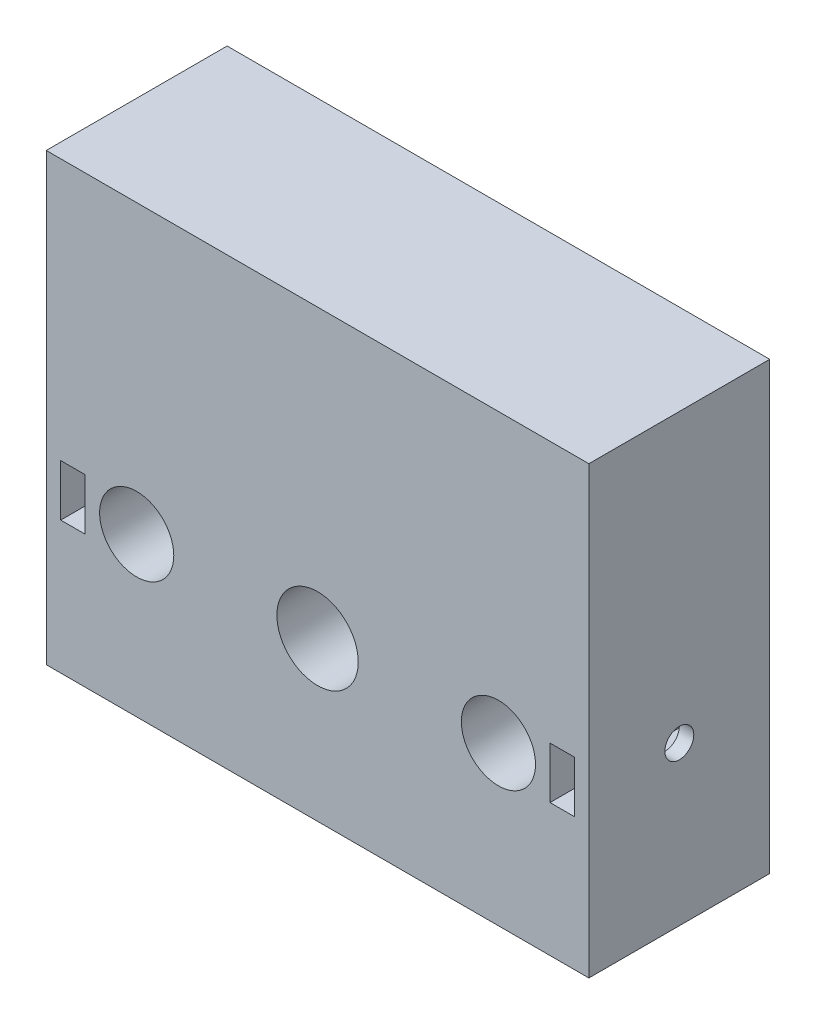
ISO-10303-21;
HEADER;
FILE_DESCRIPTION(('STEP AP214'),'2;1');
FILE_NAME('part.step','',(''),(''),'','','');
FILE_SCHEMA(('AUTOMOTIVE_DESIGN { 1 0 10303 214 1 1 1 1 }'));
ENDSEC;
DATA;
#1=APPLICATION_CONTEXT('core data for automotive mechanical design processes');
#2=APPLICATION_PROTOCOL_DEFINITION('international standard','automotive_design',2000,#1);
#3=PRODUCT_CONTEXT('',#1,'mechanical');
#4=PRODUCT('Part','Part','',(#3));
#5=PRODUCT_RELATED_PRODUCT_CATEGORY('part','',(#4));
#6=PRODUCT_DEFINITION_FORMATION('','',#4);
#7=PRODUCT_DEFINITION_CONTEXT('part definition',#1,'design');
#8=PRODUCT_DEFINITION('design','',#6,#7);
#9=PRODUCT_DEFINITION_SHAPE('','',#8);
#10=(LENGTH_UNIT() NAMED_UNIT(*) SI_UNIT(.MILLI.,.METRE.));
#11=(NAMED_UNIT(*) PLANE_ANGLE_UNIT() SI_UNIT($,.RADIAN.));
#12=(NAMED_UNIT(*) SI_UNIT($,.STERADIAN.) SOLID_ANGLE_UNIT());
#13=UNCERTAINTY_MEASURE_WITH_UNIT(LENGTH_MEASURE(1.E-05),#10,'distance_accuracy_value','');
#14=(GEOMETRIC_REPRESENTATION_CONTEXT(3) GLOBAL_UNCERTAINTY_ASSIGNED_CONTEXT((#13)) GLOBAL_UNIT_ASSIGNED_CONTEXT((#10,
#11,#12)) REPRESENTATION_CONTEXT('',''));
#15=CARTESIAN_POINT('',(0.,0.,0.));
#16=DIRECTION('',(0.,0.,1.));
#17=DIRECTION('',(1.,0.,0.));
#18=AXIS2_PLACEMENT_3D('',#15,#16,#17);
#19=CARTESIAN_POINT('',(-20.,0.,20.));
#20=DIRECTION('',(0.,0.,1.));
#21=DIRECTION('',(1.,0.,0.));
#22=AXIS2_PLACEMENT_3D('',#19,#20,#21);
#23=CYLINDRICAL_SURFACE('',#22,4.10000000000001);
#24=CARTESIAN_POINT('',(-20.,0.,0.));
#25=DIRECTION('',(0.,0.,1.));
#26=DIRECTION('',(1.,0.,0.));
#27=AXIS2_PLACEMENT_3D('',#24,#25,#26);
#28=CIRCLE('',#27,4.10000000000001);
#29=CARTESIAN_POINT('',(-15.9,0.,0.));
#30=VERTEX_POINT('',#29);
#31=EDGE_CURVE('E250',#30,#30,#28,.T.);
#32=ORIENTED_EDGE('',*,*,#31,.F.);
#33=EDGE_LOOP('',(#32));
#34=FACE_BOUND('',#33,.T.);
#35=CARTESIAN_POINT('',(-20.,0.,20.));
#36=DIRECTION('',(0.,0.,1.));
#37=DIRECTION('',(1.,0.,0.));
#38=AXIS2_PLACEMENT_3D('',#35,#36,#37);
#39=CIRCLE('',#38,4.10000000000001);
#40=CARTESIAN_POINT('',(-15.9,0.,20.));
#41=VERTEX_POINT('',#40);
#42=EDGE_CURVE('E254',#41,#41,#39,.T.);
#43=ORIENTED_EDGE('',*,*,#42,.T.);
#44=EDGE_LOOP('',(#43));
#45=FACE_BOUND('',#44,.T.);
#46=CARTESIAN_POINT('',(-24.1,0.,11.6));
#47=CARTESIAN_POINT('',(-24.1000033732094,-0.0863968574468139,11.6000043837382));
#48=CARTESIAN_POINT('',(-24.0972459568564,-0.172765027428405,11.5929806841693));
#49=CARTESIAN_POINT('',(-24.0865235130908,-0.342906637038236,11.5651964382411));
#50=CARTESIAN_POINT('',(-24.078559696829,-0.42668067538638,11.5444390866906));
#51=CARTESIAN_POINT('',(-24.0582750163142,-0.589154368792999,11.4900426105198));
#52=CARTESIAN_POINT('',(-24.0459629837231,-0.667863930039864,11.4564295856626));
#53=CARTESIAN_POINT('',(-24.0181967183786,-0.818517011902622,11.3774143934925));
#54=CARTESIAN_POINT('',(-24.0027415749342,-0.890458562685798,11.3320088083211));
#55=CARTESIAN_POINT('',(-23.9694881912767,-1.0288019706851,11.2285479781122));
#56=CARTESIAN_POINT('',(-23.951619924981,-1.09485641234281,11.170050927949));
#57=CARTESIAN_POINT('',(-23.9158840825789,-1.2165026461393,11.0430056247033));
#58=CARTESIAN_POINT('',(-23.8980165088159,-1.27209083821111,10.974453927504));
#59=CARTESIAN_POINT('',(-23.8634720395695,-1.37352834793292,10.8257439693209));
#60=CARTESIAN_POINT('',(-23.8468765502277,-1.4188712217394,10.7452194204262));
#61=CARTESIAN_POINT('',(-23.8178546593757,-1.49521448070142,10.5769396195113));
#62=CARTESIAN_POINT('',(-23.8054264356978,-1.52622113672722,10.489187548741));
#63=CARTESIAN_POINT('',(-23.7868996715276,-1.5716143800154,10.3129544506419));
#64=CARTESIAN_POINT('',(-23.780548362887,-1.58666777276007,10.2246726899068));
#65=CARTESIAN_POINT('',(-23.7741589458292,-1.60181109234261,10.0466251799236));
#66=CARTESIAN_POINT('',(-23.7741179442435,-1.60190787653147,9.95686012961871));
#67=CARTESIAN_POINT('',(-23.7801372630373,-1.58764224661908,9.78467642436961));
#68=CARTESIAN_POINT('',(-23.7857970723174,-1.57422898411503,9.70216245809431));
#69=CARTESIAN_POINT('',(-23.8019106872001,-1.53490127585592,9.54066581275514));
#70=CARTESIAN_POINT('',(-23.8123652774147,-1.50898478405201,9.46168371396409));
#71=CARTESIAN_POINT('',(-23.8371153051624,-1.44490197409869,9.30764336704062));
#72=CARTESIAN_POINT('',(-23.8514828681212,-1.40650269563911,9.23269413620769));
#73=CARTESIAN_POINT('',(-23.882418490057,-1.31870734745615,9.09003718378694));
#74=CARTESIAN_POINT('',(-23.8989873503855,-1.26930726859679,9.02233211561644));
#75=CARTESIAN_POINT('',(-23.9339380420241,-1.15665566925022,8.89086628335994));
#76=CARTESIAN_POINT('',(-23.9523637648755,-1.09265451101801,8.82775788062388));
#77=CARTESIAN_POINT('',(-23.9879154944003,-0.954774433550065,8.71296687710383));
#78=CARTESIAN_POINT('',(-24.0050412664701,-0.88089373795724,8.66128633551281));
#79=CARTESIAN_POINT('',(-24.0364560781738,-0.72357569378571,8.57001716819509));
#80=CARTESIAN_POINT('',(-24.0506885545521,-0.639990356046121,8.53066275284799));
#81=CARTESIAN_POINT('',(-24.0742888622696,-0.466690264061249,8.46679532159885));
#82=CARTESIAN_POINT('',(-24.0836590407062,-0.376978490840415,8.44227514405819));
#83=CARTESIAN_POINT('',(-24.0960571997284,-0.199449226158951,8.41006561412076));
#84=CARTESIAN_POINT('',(-24.0994153784156,-0.111813872721552,8.4014988686522));
#85=CARTESIAN_POINT('',(-24.1004434500538,0.0636973851927968,8.39886290088852));
#86=CARTESIAN_POINT('',(-24.09811473096,0.151573225747198,8.40479014116367));
#87=CARTESIAN_POINT('',(-24.0882476043303,0.321167964268044,8.43031981206483));
#88=CARTESIAN_POINT('',(-24.0809338187501,0.402990045349866,8.44933295271425));
#89=CARTESIAN_POINT('',(-24.0620619679242,0.562214399427929,8.49970320276342));
#90=CARTESIAN_POINT('',(-24.050503353803,0.639616099352731,8.53106190853815));
#91=CARTESIAN_POINT('',(-24.023837647486,0.790426854933587,8.60624992481731));
#92=CARTESIAN_POINT('',(-24.0086339813993,0.863644885914388,8.65042706823557));
#93=CARTESIAN_POINT('',(-23.976340069313,1.00188169282792,8.74960935731676));
#94=CARTESIAN_POINT('',(-23.9592490900779,1.06689726087579,8.80461871792482));
#95=CARTESIAN_POINT('',(-23.9237175430147,1.19116671019899,8.92796527736657));
#96=CARTESIAN_POINT('',(-23.9052596797031,1.2498013936763,8.99692295506457));
#97=CARTESIAN_POINT('',(-23.8700869290105,1.35480704483102,9.14404103612033));
#98=CARTESIAN_POINT('',(-23.853372273496,1.40117638233578,9.22220266077072));
#99=CARTESIAN_POINT('',(-23.8235935730478,1.4805237453572,9.38646533584587));
#100=CARTESIAN_POINT('',(-23.8105572523242,1.5134008785535,9.47262049983627));
#101=CARTESIAN_POINT('',(-23.7900983978946,1.56394110219938,9.64990223495301));
#102=CARTESIAN_POINT('',(-23.7826719913327,1.58161468972855,9.74102532974175));
#103=CARTESIAN_POINT('',(-23.774815766734,1.60026834733619,9.91888558504898));
#104=CARTESIAN_POINT('',(-23.7739387774821,1.60231556218815,10.0054918618184));
#105=CARTESIAN_POINT('',(-23.7781190338024,1.59243369480817,10.1777489236337));
#106=CARTESIAN_POINT('',(-23.7831756129312,1.5805061821828,10.2633998148954));
#107=CARTESIAN_POINT('',(-23.7982674207229,1.54386940439713,10.4281825593323));
#108=CARTESIAN_POINT('',(-23.8081178482089,1.51963322928837,10.5074380265775));
#109=CARTESIAN_POINT('',(-23.8315659871662,1.45949934500958,10.660795300734));
#110=CARTESIAN_POINT('',(-23.8451646804668,1.42359857994916,10.7348957509502));
#111=CARTESIAN_POINT('',(-23.8755137449173,1.33885139108588,10.8803103662108));
#112=CARTESIAN_POINT('',(-23.8923970142566,1.28939778958934,10.9512425322576));
#113=CARTESIAN_POINT('',(-23.9269880609251,1.17985656027569,11.0841402226593));
#114=CARTESIAN_POINT('',(-23.9446961095425,1.11976541507074,11.1461027687819));
#115=CARTESIAN_POINT('',(-23.9802291308596,0.98631510801034,11.2631401333178));
#116=CARTESIAN_POINT('',(-23.9979963003666,0.912372998645989,11.3175710111581));
#117=CARTESIAN_POINT('',(-24.0305356420814,0.755762142318989,11.4132393359647));
#118=CARTESIAN_POINT('',(-24.0453071456928,0.673091453489478,11.4544738388436));
#119=CARTESIAN_POINT('',(-24.0711484941185,0.494466204647693,11.524932125041));
#120=CARTESIAN_POINT('',(-24.0818370565342,0.397978314806346,11.5529599628001));
#121=CARTESIAN_POINT('',(-24.0962586980466,0.200979000587015,11.5904856232585));
#122=CARTESIAN_POINT('',(-24.0999960773262,0.100470103051502,11.5999949021916));
#123=CARTESIAN_POINT('',(-24.1,0.,11.6));
#124=B_SPLINE_CURVE_WITH_KNOTS('',3,(#46,#47,#48,#49,#50,#51,#52,#53,#54,#55,#56,#57,#58,#59,
#60,#61,#62,#63,#64,#65,#66,#67,#68,#69,#70,#71,#72,#73,#74,#75,#76,#77,#78,#79,#80,#81,#82,#83,
#84,#85,#86,#87,#88,#89,#90,#91,#92,#93,#94,#95,#96,#97,#98,#99,#100,#101,#102,#103,#104,#105,
#106,#107,#108,#109,#110,#111,#112,#113,#114,#115,#116,#117,#118,#119,#120,#121,#122,#123),
.UNSPECIFIED.,.T.,.F.,(4,2,2,2,2,2,2,2,2,2,2,2,2,2,2,2,2,2,2,2,2,2,2,2,2,2,2,2,2,2,2,2,2,2,2,2,
2,2,4),(0.,0.25881970802216,0.517579228928641,0.775816177676649,1.03412805538057,
1.30301613547217,1.57199653647335,1.85226204394674,2.13240484295992,2.40031100869251,
2.66809434363399,2.91829172726607,3.16853006750118,3.42373592732404,3.67903494712588,
3.95303766408762,4.22708971359851,4.50607099532339,4.78491748341413,5.04791536154827,
5.31084905832673,5.5626565075919,5.81449652816566,6.07393785644212,6.33348033663664,
6.60933983572724,6.88523598057687,7.16315920121912,7.4408903792196,7.69946909380635,
7.95801876825994,8.20730825870159,8.45666311075805,8.71983704321139,8.98309815930305,
9.26229452610695,9.54155313776344,9.84271854305257,10.143697577536),.UNSPECIFIED.);
#125=CARTESIAN_POINT('',(-24.1,0.,11.6));
#126=VERTEX_POINT('',#125);
#127=EDGE_CURVE('E162',#126,#126,#124,.T.);
#128=ORIENTED_EDGE('',*,*,#127,.F.);
#129=EDGE_LOOP('',(#128));
#130=FACE_BOUND('',#129,.T.);
#131=ADVANCED_FACE('F35',(#34,#45,#130),#23,.F.);
#132=CARTESIAN_POINT('',(0.,0.,20.));
#133=DIRECTION('',(0.,0.,-1.));
#134=DIRECTION('',(-1.,0.,0.));
#135=AXIS2_PLACEMENT_3D('',#132,#133,#134);
#136=PLANE('',#135);
#137=DIRECTION('',(0.,1.,0.));
#138=VECTOR('',#137,1.);
#139=CARTESIAN_POINT('',(30.,-17.5,20.));
#140=LINE('',#139,#138);
#141=CARTESIAN_POINT('',(30.,-17.5,20.));
#142=VERTEX_POINT('',#141);
#143=CARTESIAN_POINT('',(30.,31.75,20.));
#144=VERTEX_POINT('',#143);
#145=EDGE_CURVE('E136',#142,#144,#140,.T.);
#146=ORIENTED_EDGE('',*,*,#145,.T.);
#147=DIRECTION('',(1.,0.,0.));
#148=VECTOR('',#147,1.);
#149=CARTESIAN_POINT('',(-30.,31.75,20.));
#150=LINE('',#149,#148);
#151=CARTESIAN_POINT('',(-30.,31.75,20.));
#152=VERTEX_POINT('',#151);
#153=EDGE_CURVE('E139',#152,#144,#150,.T.);
#154=ORIENTED_EDGE('',*,*,#153,.F.);
#155=DIRECTION('',(0.,-1.,0.));
#156=VECTOR('',#155,1.);
#157=CARTESIAN_POINT('',(-30.,-17.5,20.));
#158=LINE('',#157,#156);
#159=CARTESIAN_POINT('',(-30.,-17.5,20.));
#160=VERTEX_POINT('',#159);
#161=EDGE_CURVE('E128',#152,#160,#158,.T.);
#162=ORIENTED_EDGE('',*,*,#161,.T.);
#163=DIRECTION('',(1.,0.,0.));
#164=VECTOR('',#163,1.);
#165=CARTESIAN_POINT('',(-30.,-17.5,20.));
#166=LINE('',#165,#164);
#167=EDGE_CURVE('E135',#160,#142,#166,.T.);
#168=ORIENTED_EDGE('',*,*,#167,.T.);
#169=EDGE_LOOP('',(#146,#154,#162,#168));
#170=FACE_BOUND('',#169,.T.);
#171=CARTESIAN_POINT('',(0.,0.,20.));
#172=DIRECTION('',(0.,0.,1.));
#173=DIRECTION('',(1.,0.,0.));
#174=AXIS2_PLACEMENT_3D('',#171,#172,#173);
#175=CIRCLE('',#174,4.50000000000001);
#176=CARTESIAN_POINT('',(4.50000000000001,0.,20.));
#177=VERTEX_POINT('',#176);
#178=EDGE_CURVE('E260',#177,#177,#175,.T.);
#179=ORIENTED_EDGE('',*,*,#178,.F.);
#180=EDGE_LOOP('',(#179));
#181=FACE_BOUND('',#180,.T.);
#182=ORIENTED_EDGE('',*,*,#42,.F.);
#183=EDGE_LOOP('',(#182));
#184=FACE_BOUND('',#183,.T.);
#185=CARTESIAN_POINT('',(20.,0.,20.));
#186=DIRECTION('',(0.,0.,1.));
#187=DIRECTION('',(1.,0.,0.));
#188=AXIS2_PLACEMENT_3D('',#185,#186,#187);
#189=CIRCLE('',#188,4.10000000000001);
#190=CARTESIAN_POINT('',(24.1,0.,20.));
#191=VERTEX_POINT('',#190);
#192=EDGE_CURVE('E263',#191,#191,#189,.T.);
#193=ORIENTED_EDGE('',*,*,#192,.F.);
#194=EDGE_LOOP('',(#193));
#195=FACE_BOUND('',#194,.T.);
#196=DIRECTION('',(-1.,0.,0.));
#197=VECTOR('',#196,1.);
#198=CARTESIAN_POINT('',(25.7,2.85,20.));
#199=LINE('',#198,#197);
#200=CARTESIAN_POINT('',(28.4,2.85,20.));
#201=VERTEX_POINT('',#200);
#202=CARTESIAN_POINT('',(25.7,2.85,20.));
#203=VERTEX_POINT('',#202);
#204=EDGE_CURVE('E483',#201,#203,#199,.T.);
#205=ORIENTED_EDGE('',*,*,#204,.F.);
#206=DIRECTION('',(0.,1.,0.));
#207=VECTOR('',#206,1.);
#208=CARTESIAN_POINT('',(28.4,-2.85,20.));
#209=LINE('',#208,#207);
#210=CARTESIAN_POINT('',(28.4,-2.85,20.));
#211=VERTEX_POINT('',#210);
#212=EDGE_CURVE('E214',#211,#201,#209,.T.);
#213=ORIENTED_EDGE('',*,*,#212,.F.);
#214=DIRECTION('',(1.,0.,0.));
#215=VECTOR('',#214,1.);
#216=CARTESIAN_POINT('',(25.7,-2.85,20.));
#217=LINE('',#216,#215);
#218=CARTESIAN_POINT('',(25.7,-2.85,20.));
#219=VERTEX_POINT('',#218);
#220=EDGE_CURVE('E490',#219,#211,#217,.T.);
#221=ORIENTED_EDGE('',*,*,#220,.F.);
#222=DIRECTION('',(0.,-1.,0.));
#223=VECTOR('',#222,1.);
#224=CARTESIAN_POINT('',(25.7,-2.85,20.));
#225=LINE('',#224,#223);
#226=EDGE_CURVE('E486',#203,#219,#225,.T.);
#227=ORIENTED_EDGE('',*,*,#226,.F.);
#228=EDGE_LOOP('',(#205,#213,#221,#227));
#229=FACE_BOUND('',#228,.T.);
#230=DIRECTION('',(0.,1.,0.));
#231=VECTOR('',#230,1.);
#232=CARTESIAN_POINT('',(-28.4,-2.85,20.));
#233=LINE('',#232,#231);
#234=CARTESIAN_POINT('',(-28.4,-2.85,20.));
#235=VERTEX_POINT('',#234);
#236=CARTESIAN_POINT('',(-28.4,2.85,20.));
#237=VERTEX_POINT('',#236);
#238=EDGE_CURVE('E52',#235,#237,#233,.T.);
#239=ORIENTED_EDGE('',*,*,#238,.T.);
#240=DIRECTION('',(1.,0.,0.));
#241=VECTOR('',#240,1.);
#242=CARTESIAN_POINT('',(-25.7,2.85,20.));
#243=LINE('',#242,#241);
#244=CARTESIAN_POINT('',(-25.7,2.85,20.));
#245=VERTEX_POINT('',#244);
#246=EDGE_CURVE('E297',#237,#245,#243,.T.);
#247=ORIENTED_EDGE('',*,*,#246,.T.);
#248=DIRECTION('',(0.,-1.,0.));
#249=VECTOR('',#248,1.);
#250=CARTESIAN_POINT('',(-25.7,-2.85,20.));
#251=LINE('',#250,#249);
#252=CARTESIAN_POINT('',(-25.7,-2.85,20.));
#253=VERTEX_POINT('',#252);
#254=EDGE_CURVE('E300',#245,#253,#251,.T.);
#255=ORIENTED_EDGE('',*,*,#254,.T.);
#256=DIRECTION('',(-1.,0.,0.));
#257=VECTOR('',#256,1.);
#258=CARTESIAN_POINT('',(-25.7,-2.85,20.));
#259=LINE('',#258,#257);
#260=EDGE_CURVE('E303',#253,#235,#259,.T.);
#261=ORIENTED_EDGE('',*,*,#260,.T.);
#262=EDGE_LOOP('',(#239,#247,#255,#261));
#263=FACE_BOUND('',#262,.T.);
#264=ADVANCED_FACE('F140',(#170,#181,#184,#195,#229,#263),#136,.F.);
#265=CARTESIAN_POINT('',(0.,0.,0.));
#266=DIRECTION('',(0.,0.,-1.));
#267=DIRECTION('',(-1.,0.,0.));
#268=AXIS2_PLACEMENT_3D('',#265,#266,#267);
#269=PLANE('',#268);
#270=DIRECTION('',(0.,1.,0.));
#271=VECTOR('',#270,1.);
#272=CARTESIAN_POINT('',(28.4,-2.85,0.));
#273=LINE('',#272,#271);
#274=CARTESIAN_POINT('',(28.4,-2.85,0.));
#275=VERTEX_POINT('',#274);
#276=CARTESIAN_POINT('',(28.4,2.85,0.));
#277=VERTEX_POINT('',#276);
#278=EDGE_CURVE('E217',#275,#277,#273,.T.);
#279=ORIENTED_EDGE('',*,*,#278,.T.);
#280=DIRECTION('',(-1.,0.,0.));
#281=VECTOR('',#280,1.);
#282=CARTESIAN_POINT('',(25.7,2.85,0.));
#283=LINE('',#282,#281);
#284=CARTESIAN_POINT('',(25.7,2.85,0.));
#285=VERTEX_POINT('',#284);
#286=EDGE_CURVE('E511',#277,#285,#283,.T.);
#287=ORIENTED_EDGE('',*,*,#286,.T.);
#288=DIRECTION('',(0.,-1.,0.));
#289=VECTOR('',#288,1.);
#290=CARTESIAN_POINT('',(25.7,-2.85,0.));
#291=LINE('',#290,#289);
#292=CARTESIAN_POINT('',(25.7,-2.85,0.));
#293=VERTEX_POINT('',#292);
#294=EDGE_CURVE('E508',#285,#293,#291,.T.);
#295=ORIENTED_EDGE('',*,*,#294,.T.);
#296=DIRECTION('',(1.,0.,0.));
#297=VECTOR('',#296,1.);
#298=CARTESIAN_POINT('',(25.7,-2.85,0.));
#299=LINE('',#298,#297);
#300=EDGE_CURVE('E504',#293,#275,#299,.T.);
#301=ORIENTED_EDGE('',*,*,#300,.T.);
#302=EDGE_LOOP('',(#279,#287,#295,#301));
#303=FACE_BOUND('',#302,.T.);
#304=CARTESIAN_POINT('',(20.,0.,0.));
#305=DIRECTION('',(0.,0.,1.));
#306=DIRECTION('',(1.,0.,0.));
#307=AXIS2_PLACEMENT_3D('',#304,#305,#306);
#308=CIRCLE('',#307,4.10000000000001);
#309=CARTESIAN_POINT('',(24.1,0.,0.));
#310=VERTEX_POINT('',#309);
#311=EDGE_CURVE('E258',#310,#310,#308,.T.);
#312=ORIENTED_EDGE('',*,*,#311,.T.);
#313=EDGE_LOOP('',(#312));
#314=FACE_BOUND('',#313,.T.);
#315=ORIENTED_EDGE('',*,*,#31,.T.);
#316=EDGE_LOOP('',(#315));
#317=FACE_BOUND('',#316,.T.);
#318=CARTESIAN_POINT('',(0.,0.,0.));
#319=DIRECTION('',(0.,0.,1.));
#320=DIRECTION('',(1.,0.,0.));
#321=AXIS2_PLACEMENT_3D('',#318,#319,#320);
#322=CIRCLE('',#321,4.50000000000001);
#323=CARTESIAN_POINT('',(4.50000000000001,0.,0.));
#324=VERTEX_POINT('',#323);
#325=EDGE_CURVE('E269',#324,#324,#322,.T.);
#326=ORIENTED_EDGE('',*,*,#325,.T.);
#327=EDGE_LOOP('',(#326));
#328=FACE_BOUND('',#327,.T.);
#329=DIRECTION('',(0.,1.,0.));
#330=VECTOR('',#329,1.);
#331=CARTESIAN_POINT('',(30.,-17.5,0.));
#332=LINE('',#331,#330);
#333=CARTESIAN_POINT('',(30.,-17.5,0.));
#334=VERTEX_POINT('',#333);
#335=CARTESIAN_POINT('',(30.,31.75,0.));
#336=VERTEX_POINT('',#335);
#337=EDGE_CURVE('E272',#334,#336,#332,.T.);
#338=ORIENTED_EDGE('',*,*,#337,.F.);
#339=DIRECTION('',(1.,0.,0.));
#340=VECTOR('',#339,1.);
#341=CARTESIAN_POINT('',(-30.,-17.5,0.));
#342=LINE('',#341,#340);
#343=CARTESIAN_POINT('',(-30.,-17.5,0.));
#344=VERTEX_POINT('',#343);
#345=EDGE_CURVE('E273',#344,#334,#342,.T.);
#346=ORIENTED_EDGE('',*,*,#345,.F.);
#347=DIRECTION('',(0.,-1.,0.));
#348=VECTOR('',#347,1.);
#349=CARTESIAN_POINT('',(-30.,-17.5,0.));
#350=LINE('',#349,#348);
#351=CARTESIAN_POINT('',(-30.,31.75,0.));
#352=VERTEX_POINT('',#351);
#353=EDGE_CURVE('E277',#352,#344,#350,.T.);
#354=ORIENTED_EDGE('',*,*,#353,.F.);
#355=DIRECTION('',(-1.,0.,0.));
#356=VECTOR('',#355,1.);
#357=CARTESIAN_POINT('',(-30.,31.75,0.));
#358=LINE('',#357,#356);
#359=EDGE_CURVE('E151',#336,#352,#358,.T.);
#360=ORIENTED_EDGE('',*,*,#359,.F.);
#361=EDGE_LOOP('',(#338,#346,#354,#360));
#362=FACE_BOUND('',#361,.T.);
#363=DIRECTION('',(1.,0.,0.));
#364=VECTOR('',#363,1.);
#365=CARTESIAN_POINT('',(-25.7,2.85,0.));
#366=LINE('',#365,#364);
#367=CARTESIAN_POINT('',(-28.4,2.85,0.));
#368=VERTEX_POINT('',#367);
#369=CARTESIAN_POINT('',(-25.7,2.85,0.));
#370=VERTEX_POINT('',#369);
#371=EDGE_CURVE('E294',#368,#370,#366,.T.);
#372=ORIENTED_EDGE('',*,*,#371,.F.);
#373=DIRECTION('',(0.,1.,0.));
#374=VECTOR('',#373,1.);
#375=CARTESIAN_POINT('',(-28.4,-2.85,0.));
#376=LINE('',#375,#374);
#377=CARTESIAN_POINT('',(-28.4,-2.85,0.));
#378=VERTEX_POINT('',#377);
#379=EDGE_CURVE('E170',#378,#368,#376,.T.);
#380=ORIENTED_EDGE('',*,*,#379,.F.);
#381=DIRECTION('',(-1.,0.,0.));
#382=VECTOR('',#381,1.);
#383=CARTESIAN_POINT('',(-25.7,-2.85,0.));
#384=LINE('',#383,#382);
#385=CARTESIAN_POINT('',(-25.7,-2.85,0.));
#386=VERTEX_POINT('',#385);
#387=EDGE_CURVE('E309',#386,#378,#384,.T.);
#388=ORIENTED_EDGE('',*,*,#387,.F.);
#389=DIRECTION('',(0.,-1.,0.));
#390=VECTOR('',#389,1.);
#391=CARTESIAN_POINT('',(-25.7,-2.85,0.));
#392=LINE('',#391,#390);
#393=EDGE_CURVE('E308',#370,#386,#392,.T.);
#394=ORIENTED_EDGE('',*,*,#393,.F.);
#395=EDGE_LOOP('',(#372,#380,#388,#394));
#396=FACE_BOUND('',#395,.T.);
#397=ADVANCED_FACE('F245',(#303,#314,#317,#328,#362,#396),#269,.T.);
#398=CARTESIAN_POINT('',(30.,-17.5,20.));
#399=DIRECTION('',(-1.,0.,0.));
#400=DIRECTION('',(0.,0.,1.));
#401=AXIS2_PLACEMENT_3D('',#398,#399,#400);
#402=PLANE('',#401);
#403=CARTESIAN_POINT('',(30.,0.,10.));
#404=DIRECTION('',(1.,0.,0.));
#405=DIRECTION('',(0.,0.,-1.));
#406=AXIS2_PLACEMENT_3D('',#403,#404,#405);
#407=CIRCLE('',#406,1.6);
#408=CARTESIAN_POINT('',(30.,0.,8.4));
#409=VERTEX_POINT('',#408);
#410=EDGE_CURVE('E282',#409,#409,#407,.T.);
#411=ORIENTED_EDGE('',*,*,#410,.F.);
#412=EDGE_LOOP('',(#411));
#413=FACE_BOUND('',#412,.T.);
#414=ORIENTED_EDGE('',*,*,#337,.T.);
#415=DIRECTION('',(0.,0.,-1.));
#416=VECTOR('',#415,1.);
#417=CARTESIAN_POINT('',(30.,31.75,0.));
#418=LINE('',#417,#416);
#419=EDGE_CURVE('E146',#144,#336,#418,.T.);
#420=ORIENTED_EDGE('',*,*,#419,.F.);
#421=ORIENTED_EDGE('',*,*,#145,.F.);
#422=DIRECTION('',(0.,0.,-1.));
#423=VECTOR('',#422,1.);
#424=CARTESIAN_POINT('',(30.,-17.5,20.));
#425=LINE('',#424,#423);
#426=EDGE_CURVE('E44',#142,#334,#425,.T.);
#427=ORIENTED_EDGE('',*,*,#426,.T.);
#428=EDGE_LOOP('',(#414,#420,#421,#427));
#429=FACE_BOUND('',#428,.T.);
#430=ADVANCED_FACE('F37',(#413,#429),#402,.F.);
#431=CARTESIAN_POINT('',(-30.,-17.5,20.));
#432=DIRECTION('',(1.,0.,0.));
#433=DIRECTION('',(0.,0.,-1.));
#434=AXIS2_PLACEMENT_3D('',#431,#432,#433);
#435=PLANE('',#434);
#436=CARTESIAN_POINT('',(-30.,0.,10.));
#437=DIRECTION('',(1.,0.,0.));
#438=DIRECTION('',(0.,0.,-1.));
#439=AXIS2_PLACEMENT_3D('',#436,#437,#438);
#440=CIRCLE('',#439,1.6);
#441=CARTESIAN_POINT('',(-30.,0.,8.4));
#442=VERTEX_POINT('',#441);
#443=EDGE_CURVE('E156',#442,#442,#440,.T.);
#444=ORIENTED_EDGE('',*,*,#443,.T.);
#445=EDGE_LOOP('',(#444));
#446=FACE_BOUND('',#445,.T.);
#447=ORIENTED_EDGE('',*,*,#353,.T.);
#448=DIRECTION('',(0.,0.,-1.));
#449=VECTOR('',#448,1.);
#450=CARTESIAN_POINT('',(-30.,-17.5,20.));
#451=LINE('',#450,#449);
#452=EDGE_CURVE('E11',#160,#344,#451,.T.);
#453=ORIENTED_EDGE('',*,*,#452,.F.);
#454=ORIENTED_EDGE('',*,*,#161,.F.);
#455=DIRECTION('',(0.,0.,1.));
#456=VECTOR('',#455,1.);
#457=CARTESIAN_POINT('',(-30.,31.75,0.));
#458=LINE('',#457,#456);
#459=EDGE_CURVE('E132',#352,#152,#458,.T.);
#460=ORIENTED_EDGE('',*,*,#459,.F.);
#461=EDGE_LOOP('',(#447,#453,#454,#460));
#462=FACE_BOUND('',#461,.T.);
#463=ADVANCED_FACE('F130',(#446,#462),#435,.F.);
#464=CARTESIAN_POINT('',(-30.,-17.5,20.));
#465=DIRECTION('',(0.,1.,0.));
#466=DIRECTION('',(0.,0.,1.));
#467=AXIS2_PLACEMENT_3D('',#464,#465,#466);
#468=PLANE('',#467);
#469=ORIENTED_EDGE('',*,*,#345,.T.);
#470=ORIENTED_EDGE('',*,*,#426,.F.);
#471=ORIENTED_EDGE('',*,*,#167,.F.);
#472=ORIENTED_EDGE('',*,*,#452,.T.);
#473=EDGE_LOOP('',(#469,#470,#471,#472));
#474=FACE_BOUND('',#473,.T.);
#475=ADVANCED_FACE('F330',(#474),#468,.F.);
#476=CARTESIAN_POINT('',(0.,0.,20.));
#477=DIRECTION('',(0.,0.,1.));
#478=DIRECTION('',(1.,0.,0.));
#479=AXIS2_PLACEMENT_3D('',#476,#477,#478);
#480=CYLINDRICAL_SURFACE('',#479,4.50000000000001);
#481=ORIENTED_EDGE('',*,*,#325,.F.);
#482=EDGE_LOOP('',(#481));
#483=FACE_BOUND('',#482,.T.);
#484=ORIENTED_EDGE('',*,*,#178,.T.);
#485=EDGE_LOOP('',(#484));
#486=FACE_BOUND('',#485,.T.);
#487=ADVANCED_FACE('F224',(#483,#486),#480,.F.);
#488=CARTESIAN_POINT('',(20.,0.,20.));
#489=DIRECTION('',(0.,0.,1.));
#490=DIRECTION('',(1.,0.,0.));
#491=AXIS2_PLACEMENT_3D('',#488,#489,#490);
#492=CYLINDRICAL_SURFACE('',#491,4.10000000000001);
#493=CARTESIAN_POINT('',(24.1,0.,8.4));
#494=CARTESIAN_POINT('',(24.1000033732094,0.0863968574468139,8.39999561626184));
#495=CARTESIAN_POINT('',(24.0972459568564,0.172765027428405,8.40701931583074));
#496=CARTESIAN_POINT('',(24.0865235130908,0.342906637038236,8.43480356175892));
#497=CARTESIAN_POINT('',(24.078559696829,0.42668067538638,8.45556091330935));
#498=CARTESIAN_POINT('',(24.0582750163142,0.589154368792999,8.50995738948016));
#499=CARTESIAN_POINT('',(24.0459629837231,0.667863930039864,8.54357041433736));
#500=CARTESIAN_POINT('',(24.0181967183786,0.818517011902622,8.6225856065075));
#501=CARTESIAN_POINT('',(24.0027415749342,0.890458562685798,8.66799119167894));
#502=CARTESIAN_POINT('',(23.9694881912767,1.0288019706851,8.77145202188784));
#503=CARTESIAN_POINT('',(23.951619924981,1.09485641234281,8.82994907205104));
#504=CARTESIAN_POINT('',(23.9158840825789,1.2165026461393,8.95699437529667));
#505=CARTESIAN_POINT('',(23.8980165088159,1.27209083821111,9.02554607249595));
#506=CARTESIAN_POINT('',(23.8634720395695,1.37352834793292,9.17425603067908));
#507=CARTESIAN_POINT('',(23.8468765502277,1.4188712217394,9.25478057957377));
#508=CARTESIAN_POINT('',(23.8178546593757,1.49521448070142,9.42306038048874));
#509=CARTESIAN_POINT('',(23.8054264356978,1.52622113672722,9.51081245125897));
#510=CARTESIAN_POINT('',(23.7868996715276,1.5716143800154,9.68704554935808));
#511=CARTESIAN_POINT('',(23.780548362887,1.58666777276007,9.77532731009322));
#512=CARTESIAN_POINT('',(23.7741589458292,1.60181109234261,9.95337482007637));
#513=CARTESIAN_POINT('',(23.7741179442435,1.60190787653147,10.0431398703813));
#514=CARTESIAN_POINT('',(23.7801372630373,1.58764224661908,10.2153235756304));
#515=CARTESIAN_POINT('',(23.7857970723174,1.57422898411503,10.2978375419057));
#516=CARTESIAN_POINT('',(23.8019106872001,1.53490127585592,10.4593341872449));
#517=CARTESIAN_POINT('',(23.8123652774147,1.50898478405201,10.5383162860359));
#518=CARTESIAN_POINT('',(23.8371153051624,1.44490197409869,10.6923566329594));
#519=CARTESIAN_POINT('',(23.8514828681212,1.40650269563911,10.7673058637923));
#520=CARTESIAN_POINT('',(23.882418490057,1.31870734745615,10.9099628162131));
#521=CARTESIAN_POINT('',(23.8989873503855,1.26930726859679,10.9776678843836));
#522=CARTESIAN_POINT('',(23.9339380420241,1.15665566925022,11.1091337166401));
#523=CARTESIAN_POINT('',(23.9523637648755,1.09265451101801,11.1722421193761));
#524=CARTESIAN_POINT('',(23.9879154944003,0.954774433550065,11.2870331228962));
#525=CARTESIAN_POINT('',(24.0050412664701,0.88089373795724,11.3387136644872));
#526=CARTESIAN_POINT('',(24.0364560781738,0.72357569378571,11.4299828318049));
#527=CARTESIAN_POINT('',(24.0506885545521,0.639990356046121,11.469337247152));
#528=CARTESIAN_POINT('',(24.0742888622696,0.466690264061249,11.5332046784012));
#529=CARTESIAN_POINT('',(24.0836590407062,0.376978490840415,11.5577248559418));
#530=CARTESIAN_POINT('',(24.0960571997284,0.199449226158951,11.5899343858792));
#531=CARTESIAN_POINT('',(24.0994153784156,0.111813872721552,11.5985011313478));
#532=CARTESIAN_POINT('',(24.1004434500538,-0.0636973851927968,11.6011370991115));
#533=CARTESIAN_POINT('',(24.09811473096,-0.151573225747198,11.5952098588363));
#534=CARTESIAN_POINT('',(24.0882476043303,-0.321167964268044,11.5696801879352));
#535=CARTESIAN_POINT('',(24.0809338187501,-0.402990045349866,11.5506670472858));
#536=CARTESIAN_POINT('',(24.0620619679242,-0.562214399427929,11.5002967972366));
#537=CARTESIAN_POINT('',(24.050503353803,-0.639616099352731,11.4689380914619));
#538=CARTESIAN_POINT('',(24.023837647486,-0.790426854933587,11.3937500751827));
#539=CARTESIAN_POINT('',(24.0086339813993,-0.863644885914388,11.3495729317644));
#540=CARTESIAN_POINT('',(23.976340069313,-1.00188169282792,11.2503906426832));
#541=CARTESIAN_POINT('',(23.9592490900779,-1.06689726087579,11.1953812820752));
#542=CARTESIAN_POINT('',(23.9237175430147,-1.19116671019899,11.0720347226334));
#543=CARTESIAN_POINT('',(23.9052596797031,-1.2498013936763,11.0030770449354));
#544=CARTESIAN_POINT('',(23.8700869290105,-1.35480704483102,10.8559589638797));
#545=CARTESIAN_POINT('',(23.853372273496,-1.40117638233578,10.7777973392293));
#546=CARTESIAN_POINT('',(23.8235935730478,-1.4805237453572,10.6135346641541));
#547=CARTESIAN_POINT('',(23.8105572523242,-1.5134008785535,10.5273795001637));
#548=CARTESIAN_POINT('',(23.7900983978946,-1.56394110219938,10.350097765047));
#549=CARTESIAN_POINT('',(23.7826719913327,-1.58161468972855,10.2589746702583));
#550=CARTESIAN_POINT('',(23.774815766734,-1.60026834733619,10.081114414951));
#551=CARTESIAN_POINT('',(23.7739387774821,-1.60231556218815,9.99450813818162));
#552=CARTESIAN_POINT('',(23.7781190338024,-1.59243369480817,9.8222510763663));
#553=CARTESIAN_POINT('',(23.7831756129312,-1.5805061821828,9.73660018510458));
#554=CARTESIAN_POINT('',(23.7982674207229,-1.54386940439713,9.57181744066768));
#555=CARTESIAN_POINT('',(23.8081178482089,-1.51963322928837,9.49256197342245));
#556=CARTESIAN_POINT('',(23.8315659871662,-1.45949934500958,9.33920469926605));
#557=CARTESIAN_POINT('',(23.8451646804668,-1.42359857994916,9.26510424904979));
#558=CARTESIAN_POINT('',(23.8755137449173,-1.33885139108588,9.11968963378918));
#559=CARTESIAN_POINT('',(23.8923970142566,-1.28939778958934,9.04875746774236));
#560=CARTESIAN_POINT('',(23.9269880609251,-1.17985656027569,8.91585977734069));
#561=CARTESIAN_POINT('',(23.9446961095425,-1.11976541507074,8.85389723121814));
#562=CARTESIAN_POINT('',(23.9802291308596,-0.98631510801034,8.73685986668224));
#563=CARTESIAN_POINT('',(23.9979963003666,-0.912372998645989,8.68242898884191));
#564=CARTESIAN_POINT('',(24.0305356420814,-0.755762142318989,8.58676066403531));
#565=CARTESIAN_POINT('',(24.0453071456928,-0.673091453489478,8.54552616115642));
#566=CARTESIAN_POINT('',(24.0711484941185,-0.494466204647693,8.47506787495904));
#567=CARTESIAN_POINT('',(24.0818370565342,-0.397978314806346,8.44704003719986));
#568=CARTESIAN_POINT('',(24.0962586980466,-0.200979000587015,8.40951437674148));
#569=CARTESIAN_POINT('',(24.0999960773262,-0.100470103051502,8.40000509780838));
#570=CARTESIAN_POINT('',(24.1,0.,8.4));
#571=B_SPLINE_CURVE_WITH_KNOTS('',3,(#493,#494,#495,#496,#497,#498,#499,#500,#501,#502,#503,
#504,#505,#506,#507,#508,#509,#510,#511,#512,#513,#514,#515,#516,#517,#518,#519,#520,#521,#522,
#523,#524,#525,#526,#527,#528,#529,#530,#531,#532,#533,#534,#535,#536,#537,#538,#539,#540,#541,
#542,#543,#544,#545,#546,#547,#548,#549,#550,#551,#552,#553,#554,#555,#556,#557,#558,#559,#560,
#561,#562,#563,#564,#565,#566,#567,#568,#569,#570),.UNSPECIFIED.,.T.,.F.,(4,2,2,2,2,2,2,2,2,2,2,
2,2,2,2,2,2,2,2,2,2,2,2,2,2,2,2,2,2,2,2,2,2,2,2,2,2,2,4),(0.,0.25881970802216,0.517579228928641,
0.775816177676649,1.03412805538057,1.30301613547217,1.57199653647335,1.85226204394674,
2.13240484295992,2.40031100869251,2.66809434363399,2.91829172726607,3.16853006750118,
3.42373592732404,3.67903494712588,3.95303766408761,4.22708971359851,4.50607099532339,
4.78491748341413,5.04791536154827,5.31084905832673,5.5626565075919,5.81449652816566,
6.07393785644212,6.33348033663664,6.60933983572724,6.88523598057687,7.16315920121912,
7.4408903792196,7.69946909380635,7.95801876825994,8.20730825870159,8.45666311075805,
8.71983704321139,8.98309815930305,9.26229452610695,9.54155313776344,9.84271854305257,
10.143697577536),.UNSPECIFIED.);
#572=CARTESIAN_POINT('',(24.1,0.,8.4));
#573=VERTEX_POINT('',#572);
#574=EDGE_CURVE('E207',#573,#573,#571,.T.);
#575=ORIENTED_EDGE('',*,*,#574,.T.);
#576=EDGE_LOOP('',(#575));
#577=FACE_BOUND('',#576,.T.);
#578=ORIENTED_EDGE('',*,*,#311,.F.);
#579=EDGE_LOOP('',(#578));
#580=FACE_BOUND('',#579,.T.);
#581=ORIENTED_EDGE('',*,*,#192,.T.);
#582=EDGE_LOOP('',(#581));
#583=FACE_BOUND('',#582,.T.);
#584=ADVANCED_FACE('F219',(#577,#580,#583),#492,.F.);
#585=CARTESIAN_POINT('',(28.4,-2.85,0.));
#586=DIRECTION('',(1.,0.,0.));
#587=DIRECTION('',(0.,0.,-1.));
#588=AXIS2_PLACEMENT_3D('',#585,#586,#587);
#589=PLANE('',#588);
#590=CARTESIAN_POINT('',(28.4,0.,10.));
#591=DIRECTION('',(1.,0.,0.));
#592=DIRECTION('',(0.,0.,-1.));
#593=AXIS2_PLACEMENT_3D('',#590,#591,#592);
#594=CIRCLE('',#593,1.6);
#595=CARTESIAN_POINT('',(28.4,0.,8.4));
#596=VERTEX_POINT('',#595);
#597=EDGE_CURVE('E215',#596,#596,#594,.T.);
#598=ORIENTED_EDGE('',*,*,#597,.T.);
#599=EDGE_LOOP('',(#598));
#600=FACE_BOUND('',#599,.T.);
#601=ORIENTED_EDGE('',*,*,#212,.T.);
#602=DIRECTION('',(0.,0.,1.));
#603=VECTOR('',#602,1.);
#604=CARTESIAN_POINT('',(28.4,2.85,0.));
#605=LINE('',#604,#603);
#606=EDGE_CURVE('E503',#277,#201,#605,.T.);
#607=ORIENTED_EDGE('',*,*,#606,.F.);
#608=ORIENTED_EDGE('',*,*,#278,.F.);
#609=DIRECTION('',(0.,0.,1.));
#610=VECTOR('',#609,1.);
#611=CARTESIAN_POINT('',(28.4,-2.85,0.));
#612=LINE('',#611,#610);
#613=EDGE_CURVE('E497',#275,#211,#612,.T.);
#614=ORIENTED_EDGE('',*,*,#613,.T.);
#615=EDGE_LOOP('',(#601,#607,#608,#614));
#616=FACE_BOUND('',#615,.T.);
#617=ADVANCED_FACE('F223',(#600,#616),#589,.F.);
#618=CARTESIAN_POINT('',(25.7,-2.85,0.));
#619=DIRECTION('',(0.,-1.,0.));
#620=DIRECTION('',(0.,0.,-1.));
#621=AXIS2_PLACEMENT_3D('',#618,#619,#620);
#622=PLANE('',#621);
#623=ORIENTED_EDGE('',*,*,#220,.T.);
#624=ORIENTED_EDGE('',*,*,#613,.F.);
#625=ORIENTED_EDGE('',*,*,#300,.F.);
#626=DIRECTION('',(0.,0.,1.));
#627=VECTOR('',#626,1.);
#628=CARTESIAN_POINT('',(25.7,-2.85,0.));
#629=LINE('',#628,#627);
#630=EDGE_CURVE('E499',#293,#219,#629,.T.);
#631=ORIENTED_EDGE('',*,*,#630,.T.);
#632=EDGE_LOOP('',(#623,#624,#625,#631));
#633=FACE_BOUND('',#632,.T.);
#634=ADVANCED_FACE('F204',(#633),#622,.F.);
#635=CARTESIAN_POINT('',(25.7,-2.85,0.));
#636=DIRECTION('',(-1.,0.,0.));
#637=DIRECTION('',(0.,0.,1.));
#638=AXIS2_PLACEMENT_3D('',#635,#636,#637);
#639=PLANE('',#638);
#640=CARTESIAN_POINT('',(25.7,0.,10.));
#641=DIRECTION('',(-1.,0.,0.));
#642=DIRECTION('',(0.,0.,1.));
#643=AXIS2_PLACEMENT_3D('',#640,#641,#642);
#644=CIRCLE('',#643,1.6);
#645=CARTESIAN_POINT('',(25.7,0.,11.6));
#646=VERTEX_POINT('',#645);
#647=EDGE_CURVE('E281',#646,#646,#644,.T.);
#648=ORIENTED_EDGE('',*,*,#647,.T.);
#649=EDGE_LOOP('',(#648));
#650=FACE_BOUND('',#649,.T.);
#651=ORIENTED_EDGE('',*,*,#226,.T.);
#652=ORIENTED_EDGE('',*,*,#630,.F.);
#653=ORIENTED_EDGE('',*,*,#294,.F.);
#654=DIRECTION('',(0.,0.,1.));
#655=VECTOR('',#654,1.);
#656=CARTESIAN_POINT('',(25.7,2.85,0.));
#657=LINE('',#656,#655);
#658=EDGE_CURVE('E501',#285,#203,#657,.T.);
#659=ORIENTED_EDGE('',*,*,#658,.T.);
#660=EDGE_LOOP('',(#651,#652,#653,#659));
#661=FACE_BOUND('',#660,.T.);
#662=ADVANCED_FACE('F230',(#650,#661),#639,.F.);
#663=CARTESIAN_POINT('',(25.7,2.85,0.));
#664=DIRECTION('',(0.,1.,0.));
#665=DIRECTION('',(0.,0.,1.));
#666=AXIS2_PLACEMENT_3D('',#663,#664,#665);
#667=PLANE('',#666);
#668=ORIENTED_EDGE('',*,*,#204,.T.);
#669=ORIENTED_EDGE('',*,*,#658,.F.);
#670=ORIENTED_EDGE('',*,*,#286,.F.);
#671=ORIENTED_EDGE('',*,*,#606,.T.);
#672=EDGE_LOOP('',(#668,#669,#670,#671));
#673=FACE_BOUND('',#672,.T.);
#674=ADVANCED_FACE('F202',(#673),#667,.F.);
#675=CARTESIAN_POINT('',(20.,0.,10.));
#676=DIRECTION('',(1.,0.,0.));
#677=DIRECTION('',(0.,0.,-1.));
#678=AXIS2_PLACEMENT_3D('',#675,#676,#677);
#679=CYLINDRICAL_SURFACE('',#678,1.6);
#680=ORIENTED_EDGE('',*,*,#647,.F.);
#681=EDGE_LOOP('',(#680));
#682=FACE_BOUND('',#681,.T.);
#683=ORIENTED_EDGE('',*,*,#574,.F.);
#684=EDGE_LOOP('',(#683));
#685=FACE_BOUND('',#684,.T.);
#686=ADVANCED_FACE('F198',(#682,#685),#679,.F.);
#687=ORIENTED_EDGE('',*,*,#410,.T.);
#688=EDGE_LOOP('',(#687));
#689=FACE_BOUND('',#688,.T.);
#690=ORIENTED_EDGE('',*,*,#597,.F.);
#691=EDGE_LOOP('',(#690));
#692=FACE_BOUND('',#691,.T.);
#693=ADVANCED_FACE('F196',(#689,#692),#679,.F.);
#694=CARTESIAN_POINT('',(-28.4,-2.85,0.));
#695=DIRECTION('',(1.,0.,0.));
#696=DIRECTION('',(0.,0.,-1.));
#697=AXIS2_PLACEMENT_3D('',#694,#695,#696);
#698=PLANE('',#697);
#699=CARTESIAN_POINT('',(-28.4,0.,10.));
#700=DIRECTION('',(1.,0.,0.));
#701=DIRECTION('',(0.,0.,-1.));
#702=AXIS2_PLACEMENT_3D('',#699,#700,#701);
#703=CIRCLE('',#702,1.6);
#704=CARTESIAN_POINT('',(-28.4,0.,8.4));
#705=VERTEX_POINT('',#704);
#706=EDGE_CURVE('E159',#705,#705,#703,.F.);
#707=ORIENTED_EDGE('',*,*,#706,.T.);
#708=EDGE_LOOP('',(#707));
#709=FACE_BOUND('',#708,.T.);
#710=ORIENTED_EDGE('',*,*,#238,.F.);
#711=DIRECTION('',(0.,0.,1.));
#712=VECTOR('',#711,1.);
#713=CARTESIAN_POINT('',(-28.4,-2.85,0.));
#714=LINE('',#713,#712);
#715=EDGE_CURVE('E292',#378,#235,#714,.T.);
#716=ORIENTED_EDGE('',*,*,#715,.F.);
#717=ORIENTED_EDGE('',*,*,#379,.T.);
#718=DIRECTION('',(0.,0.,1.));
#719=VECTOR('',#718,1.);
#720=CARTESIAN_POINT('',(-28.4,2.85,0.));
#721=LINE('',#720,#719);
#722=EDGE_CURVE('E286',#368,#237,#721,.T.);
#723=ORIENTED_EDGE('',*,*,#722,.T.);
#724=EDGE_LOOP('',(#710,#716,#717,#723));
#725=FACE_BOUND('',#724,.T.);
#726=ADVANCED_FACE('F187',(#709,#725),#698,.T.);
#727=CARTESIAN_POINT('',(-25.7,2.85,0.));
#728=DIRECTION('',(0.,-1.,0.));
#729=DIRECTION('',(0.,0.,-1.));
#730=AXIS2_PLACEMENT_3D('',#727,#728,#729);
#731=PLANE('',#730);
#732=ORIENTED_EDGE('',*,*,#246,.F.);
#733=ORIENTED_EDGE('',*,*,#722,.F.);
#734=ORIENTED_EDGE('',*,*,#371,.T.);
#735=DIRECTION('',(0.,0.,1.));
#736=VECTOR('',#735,1.);
#737=CARTESIAN_POINT('',(-25.7,2.85,0.));
#738=LINE('',#737,#736);
#739=EDGE_CURVE('E289',#370,#245,#738,.T.);
#740=ORIENTED_EDGE('',*,*,#739,.T.);
#741=EDGE_LOOP('',(#732,#733,#734,#740));
#742=FACE_BOUND('',#741,.T.);
#743=ADVANCED_FACE('F183',(#742),#731,.T.);
#744=CARTESIAN_POINT('',(-25.7,-2.85,0.));
#745=DIRECTION('',(-1.,0.,0.));
#746=DIRECTION('',(0.,0.,1.));
#747=AXIS2_PLACEMENT_3D('',#744,#745,#746);
#748=PLANE('',#747);
#749=CARTESIAN_POINT('',(-25.7,0.,10.));
#750=DIRECTION('',(-1.,0.,0.));
#751=DIRECTION('',(0.,0.,1.));
#752=AXIS2_PLACEMENT_3D('',#749,#750,#751);
#753=CIRCLE('',#752,1.6);
#754=CARTESIAN_POINT('',(-25.7,0.,11.6));
#755=VERTEX_POINT('',#754);
#756=EDGE_CURVE('E39',#755,#755,#753,.F.);
#757=ORIENTED_EDGE('',*,*,#756,.T.);
#758=EDGE_LOOP('',(#757));
#759=FACE_BOUND('',#758,.T.);
#760=ORIENTED_EDGE('',*,*,#254,.F.);
#761=ORIENTED_EDGE('',*,*,#739,.F.);
#762=ORIENTED_EDGE('',*,*,#393,.T.);
#763=DIRECTION('',(0.,0.,1.));
#764=VECTOR('',#763,1.);
#765=CARTESIAN_POINT('',(-25.7,-2.85,0.));
#766=LINE('',#765,#764);
#767=EDGE_CURVE('E60',#386,#253,#766,.T.);
#768=ORIENTED_EDGE('',*,*,#767,.T.);
#769=EDGE_LOOP('',(#760,#761,#762,#768));
#770=FACE_BOUND('',#769,.T.);
#771=ADVANCED_FACE('F186',(#759,#770),#748,.T.);
#772=CARTESIAN_POINT('',(-25.7,-2.85,0.));
#773=DIRECTION('',(0.,1.,0.));
#774=DIRECTION('',(0.,0.,1.));
#775=AXIS2_PLACEMENT_3D('',#772,#773,#774);
#776=PLANE('',#775);
#777=ORIENTED_EDGE('',*,*,#260,.F.);
#778=ORIENTED_EDGE('',*,*,#767,.F.);
#779=ORIENTED_EDGE('',*,*,#387,.T.);
#780=ORIENTED_EDGE('',*,*,#715,.T.);
#781=EDGE_LOOP('',(#777,#778,#779,#780));
#782=FACE_BOUND('',#781,.T.);
#783=ADVANCED_FACE('F181',(#782),#776,.T.);
#784=CARTESIAN_POINT('',(-20.,0.,10.));
#785=DIRECTION('',(-1.,0.,0.));
#786=DIRECTION('',(0.,0.,1.));
#787=AXIS2_PLACEMENT_3D('',#784,#785,#786);
#788=CYLINDRICAL_SURFACE('',#787,1.6);
#789=ORIENTED_EDGE('',*,*,#756,.F.);
#790=EDGE_LOOP('',(#789));
#791=FACE_BOUND('',#790,.T.);
#792=ORIENTED_EDGE('',*,*,#127,.T.);
#793=EDGE_LOOP('',(#792));
#794=FACE_BOUND('',#793,.T.);
#795=ADVANCED_FACE('F175',(#791,#794),#788,.F.);
#796=ORIENTED_EDGE('',*,*,#706,.F.);
#797=EDGE_LOOP('',(#796));
#798=FACE_BOUND('',#797,.T.);
#799=ORIENTED_EDGE('',*,*,#443,.F.);
#800=EDGE_LOOP('',(#799));
#801=FACE_BOUND('',#800,.T.);
#802=ADVANCED_FACE('F180',(#798,#801),#788,.F.);
#803=CARTESIAN_POINT('',(0.,31.75,0.));
#804=DIRECTION('',(0.,1.,0.));
#805=DIRECTION('',(0.,0.,1.));
#806=AXIS2_PLACEMENT_3D('',#803,#804,#805);
#807=PLANE('',#806);
#808=ORIENTED_EDGE('',*,*,#459,.T.);
#809=ORIENTED_EDGE('',*,*,#153,.T.);
#810=ORIENTED_EDGE('',*,*,#419,.T.);
#811=ORIENTED_EDGE('',*,*,#359,.T.);
#812=EDGE_LOOP('',(#808,#809,#810,#811));
#813=FACE_BOUND('',#812,.T.);
#814=ADVANCED_FACE('F149',(#813),#807,.T.);
#815=CLOSED_SHELL('',(#131,#264,#397,#430,#463,#475,#487,#584,#617,#634,#662,#674,#686,#693,
#726,#743,#771,#783,#795,#802,#814));
#816=MANIFOLD_SOLID_BREP('B2',#815);
#817=ADVANCED_BREP_SHAPE_REPRESENTATION('',(#18,#816),#14);
#818=SHAPE_DEFINITION_REPRESENTATION(#9,#817);
ENDSEC;
END-ISO-10303-21;
